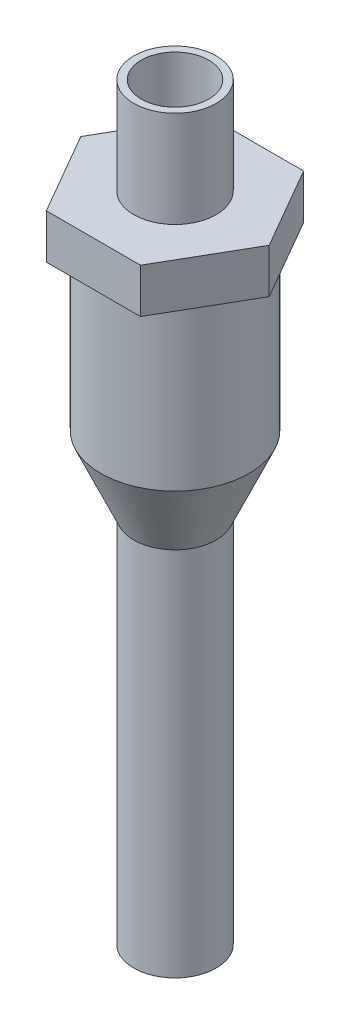
ISO-10303-21;
HEADER;
FILE_DESCRIPTION(('STEP AP214'),'2;1');
FILE_NAME('part.step','',(''),(''),'','','');
FILE_SCHEMA(('AUTOMOTIVE_DESIGN { 1 0 10303 214 1 1 1 1 }'));
ENDSEC;
DATA;
#1=APPLICATION_CONTEXT('core data for automotive mechanical design processes');
#2=APPLICATION_PROTOCOL_DEFINITION('international standard','automotive_design',2000,#1);
#3=PRODUCT_CONTEXT('',#1,'mechanical');
#4=PRODUCT('Part','Part','',(#3));
#5=PRODUCT_RELATED_PRODUCT_CATEGORY('part','',(#4));
#6=PRODUCT_DEFINITION_FORMATION('','',#4);
#7=PRODUCT_DEFINITION_CONTEXT('part definition',#1,'design');
#8=PRODUCT_DEFINITION('design','',#6,#7);
#9=PRODUCT_DEFINITION_SHAPE('','',#8);
#10=(LENGTH_UNIT() NAMED_UNIT(*) SI_UNIT(.MILLI.,.METRE.));
#11=(NAMED_UNIT(*) PLANE_ANGLE_UNIT() SI_UNIT($,.RADIAN.));
#12=(NAMED_UNIT(*) SI_UNIT($,.STERADIAN.) SOLID_ANGLE_UNIT());
#13=UNCERTAINTY_MEASURE_WITH_UNIT(LENGTH_MEASURE(1.E-05),#10,'distance_accuracy_value','');
#14=(GEOMETRIC_REPRESENTATION_CONTEXT(3) GLOBAL_UNCERTAINTY_ASSIGNED_CONTEXT((#13)) GLOBAL_UNIT_ASSIGNED_CONTEXT((#10,
#11,#12)) REPRESENTATION_CONTEXT('',''));
#15=CARTESIAN_POINT('',(0.,0.,0.));
#16=DIRECTION('',(0.,0.,1.));
#17=DIRECTION('',(1.,0.,0.));
#18=AXIS2_PLACEMENT_3D('',#15,#16,#17);
#19=CARTESIAN_POINT('',(0.,13.,0.));
#20=DIRECTION('',(0.,1.,0.));
#21=DIRECTION('',(-1.,0.,0.));
#22=AXIS2_PLACEMENT_3D('',#19,#20,#21);
#23=CYLINDRICAL_SURFACE('',#22,10.);
#24=CARTESIAN_POINT('',(0.,-28.,0.));
#25=DIRECTION('',(0.,1.,0.));
#26=DIRECTION('',(-1.,0.,0.));
#27=AXIS2_PLACEMENT_3D('',#24,#25,#26);
#28=CIRCLE('',#27,10.);
#29=CARTESIAN_POINT('',(-9.99999999999999,-28.,0.));
#30=VERTEX_POINT('',#29);
#31=EDGE_CURVE('E181',#30,#30,#28,.T.);
#32=ORIENTED_EDGE('',*,*,#31,.T.);
#33=EDGE_LOOP('',(#32));
#34=FACE_BOUND('',#33,.T.);
#35=CARTESIAN_POINT('',(0.,-6.,0.));
#36=DIRECTION('',(0.,1.,0.));
#37=DIRECTION('',(-1.,0.,0.));
#38=AXIS2_PLACEMENT_3D('',#35,#36,#37);
#39=CIRCLE('',#38,10.);
#40=CARTESIAN_POINT('',(-9.99999999999999,-6.,0.));
#41=VERTEX_POINT('',#40);
#42=EDGE_CURVE('E12',#41,#41,#39,.T.);
#43=ORIENTED_EDGE('',*,*,#42,.F.);
#44=EDGE_LOOP('',(#43));
#45=FACE_BOUND('',#44,.T.);
#46=ADVANCED_FACE('F44',(#34,#45),#23,.T.);
#47=CARTESIAN_POINT('',(0.,-38.,0.));
#48=DIRECTION('',(0.,1.,0.));
#49=DIRECTION('',(-1.,0.,0.));
#50=AXIS2_PLACEMENT_3D('',#47,#48,#49);
#51=CONICAL_SURFACE('',#50,5.55625,0.418166338393955);
#52=ORIENTED_EDGE('',*,*,#31,.F.);
#53=EDGE_LOOP('',(#52));
#54=FACE_BOUND('',#53,.T.);
#55=CARTESIAN_POINT('',(0.,-38.,0.));
#56=DIRECTION('',(0.,1.,0.));
#57=DIRECTION('',(-1.,0.,0.));
#58=AXIS2_PLACEMENT_3D('',#55,#56,#57);
#59=CIRCLE('',#58,5.55625);
#60=CARTESIAN_POINT('',(-5.55624999999999,-38.,0.));
#61=VERTEX_POINT('',#60);
#62=EDGE_CURVE('E177',#61,#61,#59,.T.);
#63=ORIENTED_EDGE('',*,*,#62,.T.);
#64=EDGE_LOOP('',(#63));
#65=FACE_BOUND('',#64,.T.);
#66=ADVANCED_FACE('F220',(#54,#65),#51,.T.);
#67=CARTESIAN_POINT('',(0.,13.,0.));
#68=DIRECTION('',(0.,1.,0.));
#69=DIRECTION('',(-1.,0.,0.));
#70=AXIS2_PLACEMENT_3D('',#67,#68,#69);
#71=CYLINDRICAL_SURFACE('',#70,5.55625);
#72=ORIENTED_EDGE('',*,*,#62,.F.);
#73=EDGE_LOOP('',(#72));
#74=FACE_BOUND('',#73,.T.);
#75=CARTESIAN_POINT('',(0.,-88.,0.));
#76=DIRECTION('',(0.,1.,0.));
#77=DIRECTION('',(-1.,0.,0.));
#78=AXIS2_PLACEMENT_3D('',#75,#76,#77);
#79=CIRCLE('',#78,5.55624999999999);
#80=CARTESIAN_POINT('',(-5.55624999999998,-88.,0.));
#81=VERTEX_POINT('',#80);
#82=EDGE_CURVE('E164',#81,#81,#79,.T.);
#83=ORIENTED_EDGE('',*,*,#82,.T.);
#84=EDGE_LOOP('',(#83));
#85=FACE_BOUND('',#84,.T.);
#86=ADVANCED_FACE('F226',(#74,#85),#71,.T.);
#87=CARTESIAN_POINT('',(5.55625000000001,-88.,0.));
#88=DIRECTION('',(0.,1.,0.));
#89=DIRECTION('',(-1.,0.,0.));
#90=AXIS2_PLACEMENT_3D('',#87,#88,#89);
#91=PLANE('',#90);
#92=ORIENTED_EDGE('',*,*,#82,.F.);
#93=EDGE_LOOP('',(#92));
#94=FACE_BOUND('',#93,.T.);
#95=ADVANCED_FACE('F216',(#94),#91,.F.);
#96=CARTESIAN_POINT('',(6.35085296108589,-6.,11.));
#97=DIRECTION('',(0.866025403784439,0.,0.5));
#98=DIRECTION('',(0.5,0.,-0.866025403784439));
#99=AXIS2_PLACEMENT_3D('',#96,#97,#98);
#100=PLANE('',#99);
#101=DIRECTION('',(0.5,0.,-0.866025403784439));
#102=VECTOR('',#101,1.);
#103=CARTESIAN_POINT('',(6.35085296108589,0.,11.));
#104=LINE('',#103,#102);
#105=CARTESIAN_POINT('',(6.35085296108589,0.,11.));
#106=VERTEX_POINT('',#105);
#107=CARTESIAN_POINT('',(12.7017059221718,0.,0.));
#108=VERTEX_POINT('',#107);
#109=EDGE_CURVE('E140',#106,#108,#104,.T.);
#110=ORIENTED_EDGE('',*,*,#109,.F.);
#111=DIRECTION('',(0.,1.,0.));
#112=VECTOR('',#111,1.);
#113=CARTESIAN_POINT('',(6.35085296108589,-6.,11.));
#114=LINE('',#113,#112);
#115=CARTESIAN_POINT('',(6.35085296108589,-6.,11.));
#116=VERTEX_POINT('',#115);
#117=EDGE_CURVE('E62',#116,#106,#114,.T.);
#118=ORIENTED_EDGE('',*,*,#117,.F.);
#119=DIRECTION('',(0.5,0.,-0.866025403784439));
#120=VECTOR('',#119,1.);
#121=CARTESIAN_POINT('',(6.35085296108589,-6.,11.));
#122=LINE('',#121,#120);
#123=CARTESIAN_POINT('',(12.7017059221718,-6.,0.));
#124=VERTEX_POINT('',#123);
#125=EDGE_CURVE('E161',#116,#124,#122,.T.);
#126=ORIENTED_EDGE('',*,*,#125,.T.);
#127=DIRECTION('',(0.,1.,0.));
#128=VECTOR('',#127,1.);
#129=CARTESIAN_POINT('',(12.7017059221718,-6.,0.));
#130=LINE('',#129,#128);
#131=EDGE_CURVE('E97',#124,#108,#130,.T.);
#132=ORIENTED_EDGE('',*,*,#131,.T.);
#133=EDGE_LOOP('',(#110,#118,#126,#132));
#134=FACE_BOUND('',#133,.T.);
#135=ADVANCED_FACE('F203',(#134),#100,.T.);
#136=CARTESIAN_POINT('',(-6.35085296108588,-6.,11.));
#137=DIRECTION('',(0.,0.,1.));
#138=DIRECTION('',(1.,0.,0.));
#139=AXIS2_PLACEMENT_3D('',#136,#137,#138);
#140=PLANE('',#139);
#141=DIRECTION('',(1.,0.,0.));
#142=VECTOR('',#141,1.);
#143=CARTESIAN_POINT('',(-6.35085296108588,0.,11.));
#144=LINE('',#143,#142);
#145=CARTESIAN_POINT('',(-6.35085296108588,0.,11.));
#146=VERTEX_POINT('',#145);
#147=EDGE_CURVE('E158',#146,#106,#144,.T.);
#148=ORIENTED_EDGE('',*,*,#147,.F.);
#149=DIRECTION('',(0.,1.,0.));
#150=VECTOR('',#149,1.);
#151=CARTESIAN_POINT('',(-6.35085296108588,-6.,11.));
#152=LINE('',#151,#150);
#153=CARTESIAN_POINT('',(-6.35085296108588,-6.,11.));
#154=VERTEX_POINT('',#153);
#155=EDGE_CURVE('E85',#154,#146,#152,.T.);
#156=ORIENTED_EDGE('',*,*,#155,.F.);
#157=DIRECTION('',(1.,0.,0.));
#158=VECTOR('',#157,1.);
#159=CARTESIAN_POINT('',(-6.35085296108588,-6.,11.));
#160=LINE('',#159,#158);
#161=EDGE_CURVE('E124',#154,#116,#160,.T.);
#162=ORIENTED_EDGE('',*,*,#161,.T.);
#163=ORIENTED_EDGE('',*,*,#117,.T.);
#164=EDGE_LOOP('',(#148,#156,#162,#163));
#165=FACE_BOUND('',#164,.T.);
#166=ADVANCED_FACE('F208',(#165),#140,.T.);
#167=CARTESIAN_POINT('',(-12.7017059221718,-6.,0.));
#168=DIRECTION('',(-0.866025403784439,0.,0.5));
#169=DIRECTION('',(0.5,0.,0.866025403784439));
#170=AXIS2_PLACEMENT_3D('',#167,#168,#169);
#171=PLANE('',#170);
#172=DIRECTION('',(0.5,0.,0.866025403784438));
#173=VECTOR('',#172,1.);
#174=CARTESIAN_POINT('',(-12.7017059221718,0.,0.));
#175=LINE('',#174,#173);
#176=CARTESIAN_POINT('',(-12.7017059221718,0.,0.));
#177=VERTEX_POINT('',#176);
#178=EDGE_CURVE('E110',#177,#146,#175,.T.);
#179=ORIENTED_EDGE('',*,*,#178,.F.);
#180=DIRECTION('',(0.,1.,0.));
#181=VECTOR('',#180,1.);
#182=CARTESIAN_POINT('',(-12.7017059221718,-6.,0.));
#183=LINE('',#182,#181);
#184=CARTESIAN_POINT('',(-12.7017059221718,-6.,0.));
#185=VERTEX_POINT('',#184);
#186=EDGE_CURVE('E105',#185,#177,#183,.T.);
#187=ORIENTED_EDGE('',*,*,#186,.F.);
#188=DIRECTION('',(0.5,0.,0.866025403784438));
#189=VECTOR('',#188,1.);
#190=CARTESIAN_POINT('',(-12.7017059221718,-6.,0.));
#191=LINE('',#190,#189);
#192=EDGE_CURVE('E108',#185,#154,#191,.T.);
#193=ORIENTED_EDGE('',*,*,#192,.T.);
#194=ORIENTED_EDGE('',*,*,#155,.T.);
#195=EDGE_LOOP('',(#179,#187,#193,#194));
#196=FACE_BOUND('',#195,.T.);
#197=ADVANCED_FACE('F107',(#196),#171,.T.);
#198=CARTESIAN_POINT('',(-6.35085296108588,-6.,-11.));
#199=DIRECTION('',(-0.866025403784439,0.,-0.5));
#200=DIRECTION('',(-0.5,0.,0.866025403784439));
#201=AXIS2_PLACEMENT_3D('',#198,#199,#200);
#202=PLANE('',#201);
#203=DIRECTION('',(-0.5,0.,0.866025403784439));
#204=VECTOR('',#203,1.);
#205=CARTESIAN_POINT('',(-6.35085296108588,0.,-11.));
#206=LINE('',#205,#204);
#207=CARTESIAN_POINT('',(-6.35085296108588,0.,-11.));
#208=VERTEX_POINT('',#207);
#209=EDGE_CURVE('E153',#208,#177,#206,.T.);
#210=ORIENTED_EDGE('',*,*,#209,.F.);
#211=DIRECTION('',(0.,1.,0.));
#212=VECTOR('',#211,1.);
#213=CARTESIAN_POINT('',(-6.35085296108588,-6.,-11.));
#214=LINE('',#213,#212);
#215=CARTESIAN_POINT('',(-6.35085296108588,-6.,-11.));
#216=VERTEX_POINT('',#215);
#217=EDGE_CURVE('E116',#216,#208,#214,.T.);
#218=ORIENTED_EDGE('',*,*,#217,.F.);
#219=DIRECTION('',(-0.5,0.,0.866025403784439));
#220=VECTOR('',#219,1.);
#221=CARTESIAN_POINT('',(-6.35085296108588,-6.,-11.));
#222=LINE('',#221,#220);
#223=EDGE_CURVE('E122',#216,#185,#222,.T.);
#224=ORIENTED_EDGE('',*,*,#223,.T.);
#225=ORIENTED_EDGE('',*,*,#186,.T.);
#226=EDGE_LOOP('',(#210,#218,#224,#225));
#227=FACE_BOUND('',#226,.T.);
#228=ADVANCED_FACE('F127',(#227),#202,.T.);
#229=CARTESIAN_POINT('',(6.35085296108589,-6.,-11.));
#230=DIRECTION('',(0.,0.,-1.));
#231=DIRECTION('',(-1.,0.,0.));
#232=AXIS2_PLACEMENT_3D('',#229,#230,#231);
#233=PLANE('',#232);
#234=DIRECTION('',(-1.,0.,0.));
#235=VECTOR('',#234,1.);
#236=CARTESIAN_POINT('',(6.35085296108589,0.,-11.));
#237=LINE('',#236,#235);
#238=CARTESIAN_POINT('',(6.35085296108589,0.,-11.));
#239=VERTEX_POINT('',#238);
#240=EDGE_CURVE('E149',#239,#208,#237,.T.);
#241=ORIENTED_EDGE('',*,*,#240,.F.);
#242=DIRECTION('',(0.,1.,0.));
#243=VECTOR('',#242,1.);
#244=CARTESIAN_POINT('',(6.35085296108589,-6.,-11.));
#245=LINE('',#244,#243);
#246=CARTESIAN_POINT('',(6.35085296108589,-6.,-11.));
#247=VERTEX_POINT('',#246);
#248=EDGE_CURVE('E169',#247,#239,#245,.T.);
#249=ORIENTED_EDGE('',*,*,#248,.F.);
#250=DIRECTION('',(-1.,0.,0.));
#251=VECTOR('',#250,1.);
#252=CARTESIAN_POINT('',(6.35085296108589,-6.,-11.));
#253=LINE('',#252,#251);
#254=EDGE_CURVE('E129',#247,#216,#253,.T.);
#255=ORIENTED_EDGE('',*,*,#254,.T.);
#256=ORIENTED_EDGE('',*,*,#217,.T.);
#257=EDGE_LOOP('',(#241,#249,#255,#256));
#258=FACE_BOUND('',#257,.T.);
#259=ADVANCED_FACE('F207',(#258),#233,.T.);
#260=CARTESIAN_POINT('',(12.7017059221718,-6.,0.));
#261=DIRECTION('',(0.866025403784439,0.,-0.5));
#262=DIRECTION('',(-0.5,0.,-0.866025403784439));
#263=AXIS2_PLACEMENT_3D('',#260,#261,#262);
#264=PLANE('',#263);
#265=DIRECTION('',(-0.5,0.,-0.866025403784439));
#266=VECTOR('',#265,1.);
#267=CARTESIAN_POINT('',(12.7017059221718,0.,0.));
#268=LINE('',#267,#266);
#269=EDGE_CURVE('E144',#108,#239,#268,.T.);
#270=ORIENTED_EDGE('',*,*,#269,.F.);
#271=ORIENTED_EDGE('',*,*,#131,.F.);
#272=DIRECTION('',(-0.5,0.,-0.866025403784439));
#273=VECTOR('',#272,1.);
#274=CARTESIAN_POINT('',(12.7017059221718,-6.,0.));
#275=LINE('',#274,#273);
#276=EDGE_CURVE('E134',#124,#247,#275,.T.);
#277=ORIENTED_EDGE('',*,*,#276,.T.);
#278=ORIENTED_EDGE('',*,*,#248,.T.);
#279=EDGE_LOOP('',(#270,#271,#277,#278));
#280=FACE_BOUND('',#279,.T.);
#281=ADVANCED_FACE('F204',(#280),#264,.T.);
#282=CARTESIAN_POINT('',(0.,-6.,0.));
#283=DIRECTION('',(0.,1.,0.));
#284=DIRECTION('',(-1.,0.,0.));
#285=AXIS2_PLACEMENT_3D('',#282,#283,#284);
#286=PLANE('',#285);
#287=ORIENTED_EDGE('',*,*,#42,.T.);
#288=EDGE_LOOP('',(#287));
#289=FACE_BOUND('',#288,.T.);
#290=ORIENTED_EDGE('',*,*,#125,.F.);
#291=ORIENTED_EDGE('',*,*,#161,.F.);
#292=ORIENTED_EDGE('',*,*,#192,.F.);
#293=ORIENTED_EDGE('',*,*,#223,.F.);
#294=ORIENTED_EDGE('',*,*,#254,.F.);
#295=ORIENTED_EDGE('',*,*,#276,.F.);
#296=EDGE_LOOP('',(#290,#291,#292,#293,#294,#295));
#297=FACE_BOUND('',#296,.T.);
#298=ADVANCED_FACE('F120',(#289,#297),#286,.F.);
#299=CARTESIAN_POINT('',(0.,13.,0.));
#300=DIRECTION('',(0.,-1.,0.));
#301=DIRECTION('',(1.,0.,0.));
#302=AXIS2_PLACEMENT_3D('',#299,#300,#301);
#303=PLANE('',#302);
#304=CARTESIAN_POINT('',(0.,13.,0.));
#305=DIRECTION('',(0.,1.,0.));
#306=DIRECTION('',(-1.,0.,0.));
#307=AXIS2_PLACEMENT_3D('',#304,#305,#306);
#308=CIRCLE('',#307,4.55625);
#309=CARTESIAN_POINT('',(-4.55624999999999,13.,0.));
#310=VERTEX_POINT('',#309);
#311=EDGE_CURVE('E378',#310,#310,#308,.T.);
#312=ORIENTED_EDGE('',*,*,#311,.F.);
#313=EDGE_LOOP('',(#312));
#314=FACE_BOUND('',#313,.T.);
#315=CARTESIAN_POINT('',(0.,13.,0.));
#316=DIRECTION('',(0.,1.,0.));
#317=DIRECTION('',(-1.,0.,0.));
#318=AXIS2_PLACEMENT_3D('',#315,#316,#317);
#319=CIRCLE('',#318,5.55625);
#320=CARTESIAN_POINT('',(-5.55625,13.,0.));
#321=VERTEX_POINT('',#320);
#322=EDGE_CURVE('E54',#321,#321,#319,.T.);
#323=ORIENTED_EDGE('',*,*,#322,.T.);
#324=EDGE_LOOP('',(#323));
#325=FACE_BOUND('',#324,.T.);
#326=ADVANCED_FACE('F46',(#314,#325),#303,.F.);
#327=CARTESIAN_POINT('',(0.,13.,0.));
#328=DIRECTION('',(0.,1.,0.));
#329=DIRECTION('',(-1.,0.,0.));
#330=AXIS2_PLACEMENT_3D('',#327,#328,#329);
#331=CYLINDRICAL_SURFACE('',#330,5.55625);
#332=ORIENTED_EDGE('',*,*,#322,.F.);
#333=EDGE_LOOP('',(#332));
#334=FACE_BOUND('',#333,.T.);
#335=CARTESIAN_POINT('',(0.,0.,0.));
#336=DIRECTION('',(0.,1.,0.));
#337=DIRECTION('',(-1.,0.,0.));
#338=AXIS2_PLACEMENT_3D('',#335,#336,#337);
#339=CIRCLE('',#338,5.55625);
#340=CARTESIAN_POINT('',(-5.55624999999999,0.,0.));
#341=VERTEX_POINT('',#340);
#342=EDGE_CURVE('E185',#341,#341,#339,.T.);
#343=ORIENTED_EDGE('',*,*,#342,.T.);
#344=EDGE_LOOP('',(#343));
#345=FACE_BOUND('',#344,.T.);
#346=ADVANCED_FACE('F193',(#334,#345),#331,.T.);
#347=CARTESIAN_POINT('',(5.55625,0.,0.));
#348=DIRECTION('',(0.,-1.,0.));
#349=DIRECTION('',(1.,0.,0.));
#350=AXIS2_PLACEMENT_3D('',#347,#348,#349);
#351=PLANE('',#350);
#352=ORIENTED_EDGE('',*,*,#342,.F.);
#353=EDGE_LOOP('',(#352));
#354=FACE_BOUND('',#353,.T.);
#355=ORIENTED_EDGE('',*,*,#109,.T.);
#356=ORIENTED_EDGE('',*,*,#269,.T.);
#357=ORIENTED_EDGE('',*,*,#240,.T.);
#358=ORIENTED_EDGE('',*,*,#209,.T.);
#359=ORIENTED_EDGE('',*,*,#178,.T.);
#360=ORIENTED_EDGE('',*,*,#147,.T.);
#361=EDGE_LOOP('',(#355,#356,#357,#358,#359,#360));
#362=FACE_BOUND('',#361,.T.);
#363=ADVANCED_FACE('F196',(#354,#362),#351,.F.);
#364=CARTESIAN_POINT('',(0.,-100.887021087125,0.));
#365=DIRECTION('',(0.,1.,0.));
#366=DIRECTION('',(-1.,0.,0.));
#367=AXIS2_PLACEMENT_3D('',#364,#365,#366);
#368=CYLINDRICAL_SURFACE('',#367,4.55625);
#369=CARTESIAN_POINT('',(0.,-86.,0.));
#370=DIRECTION('',(0.,1.,0.));
#371=DIRECTION('',(-1.,0.,0.));
#372=AXIS2_PLACEMENT_3D('',#369,#370,#371);
#373=CIRCLE('',#372,4.55625);
#374=CARTESIAN_POINT('',(-4.55624999999998,-86.,0.));
#375=VERTEX_POINT('',#374);
#376=EDGE_CURVE('E145',#375,#375,#373,.F.);
#377=CARTESIAN_POINT('',(-4.55624999999998,-86.,0.));
#378=CARTESIAN_POINT('',(-4.55624999999998,-84.96875,0.));
#379=CARTESIAN_POINT('',(-4.55624999999998,-83.9375,0.));
#380=CARTESIAN_POINT('',(-4.55624999999998,-81.875,0.));
#381=CARTESIAN_POINT('',(-4.55624999999998,-80.84375,0.));
#382=CARTESIAN_POINT('',(-4.55624999999998,-78.78125,0.));
#383=CARTESIAN_POINT('',(-4.55624999999998,-77.75,0.));
#384=CARTESIAN_POINT('',(-4.55624999999998,-75.6875,0.));
#385=CARTESIAN_POINT('',(-4.55624999999998,-74.65625,0.));
#386=CARTESIAN_POINT('',(-4.55624999999998,-72.59375,0.));
#387=CARTESIAN_POINT('',(-4.55624999999998,-71.5625,0.));
#388=CARTESIAN_POINT('',(-4.55624999999998,-69.5,0.));
#389=CARTESIAN_POINT('',(-4.55624999999998,-68.46875,0.));
#390=CARTESIAN_POINT('',(-4.55624999999998,-66.40625,0.));
#391=CARTESIAN_POINT('',(-4.55624999999998,-65.375,0.));
#392=CARTESIAN_POINT('',(-4.55624999999998,-63.3125,0.));
#393=CARTESIAN_POINT('',(-4.55624999999998,-62.28125,0.));
#394=CARTESIAN_POINT('',(-4.55624999999998,-60.21875,0.));
#395=CARTESIAN_POINT('',(-4.55624999999998,-59.1875,0.));
#396=CARTESIAN_POINT('',(-4.55624999999998,-57.125,0.));
#397=CARTESIAN_POINT('',(-4.55624999999999,-56.09375,0.));
#398=CARTESIAN_POINT('',(-4.55624999999999,-54.03125,0.));
#399=CARTESIAN_POINT('',(-4.55624999999999,-53.,0.));
#400=CARTESIAN_POINT('',(-4.55624999999999,-50.9375,0.));
#401=CARTESIAN_POINT('',(-4.55624999999999,-49.90625,0.));
#402=CARTESIAN_POINT('',(-4.55624999999999,-47.84375,0.));
#403=CARTESIAN_POINT('',(-4.55624999999999,-46.8125,0.));
#404=CARTESIAN_POINT('',(-4.55624999999999,-44.75,0.));
#405=CARTESIAN_POINT('',(-4.55624999999999,-43.71875,0.));
#406=CARTESIAN_POINT('',(-4.55624999999999,-41.65625,0.));
#407=CARTESIAN_POINT('',(-4.55624999999999,-40.625,0.));
#408=CARTESIAN_POINT('',(-4.55624999999999,-38.5625,0.));
#409=CARTESIAN_POINT('',(-4.55624999999999,-37.53125,0.));
#410=CARTESIAN_POINT('',(-4.55624999999999,-35.46875,0.));
#411=CARTESIAN_POINT('',(-4.55624999999999,-34.4375,0.));
#412=CARTESIAN_POINT('',(-4.55624999999999,-32.375,0.));
#413=CARTESIAN_POINT('',(-4.55624999999999,-31.34375,0.));
#414=CARTESIAN_POINT('',(-4.55624999999999,-29.28125,0.));
#415=CARTESIAN_POINT('',(-4.55624999999999,-28.25,0.));
#416=CARTESIAN_POINT('',(-4.55624999999999,-26.1875,0.));
#417=CARTESIAN_POINT('',(-4.55624999999999,-25.15625,0.));
#418=CARTESIAN_POINT('',(-4.55624999999999,-23.09375,0.));
#419=CARTESIAN_POINT('',(-4.55624999999999,-22.0625,0.));
#420=CARTESIAN_POINT('',(-4.55624999999999,-20.,0.));
#421=CARTESIAN_POINT('',(-4.55624999999999,-18.96875,0.));
#422=CARTESIAN_POINT('',(-4.55624999999999,-16.90625,0.));
#423=CARTESIAN_POINT('',(-4.55624999999999,-15.875,0.));
#424=CARTESIAN_POINT('',(-4.55624999999999,-13.8125,0.));
#425=CARTESIAN_POINT('',(-4.55624999999999,-12.78125,0.));
#426=CARTESIAN_POINT('',(-4.55624999999999,-10.71875,0.));
#427=CARTESIAN_POINT('',(-4.55624999999999,-9.68750000000001,0.));
#428=CARTESIAN_POINT('',(-4.55624999999999,-7.62500000000002,0.));
#429=CARTESIAN_POINT('',(-4.55624999999999,-6.59375000000001,0.));
#430=CARTESIAN_POINT('',(-4.55624999999999,-4.53125000000001,0.));
#431=CARTESIAN_POINT('',(-4.55624999999999,-3.50000000000001,0.));
#432=CARTESIAN_POINT('',(-4.55624999999999,-1.4375,0.));
#433=CARTESIAN_POINT('',(-4.55624999999999,-0.406250000000001,0.));
#434=CARTESIAN_POINT('',(-4.55624999999999,1.65624999999999,0.));
#435=CARTESIAN_POINT('',(-4.55624999999999,2.68749999999999,0.));
#436=CARTESIAN_POINT('',(-4.55624999999999,4.74999999999998,0.));
#437=CARTESIAN_POINT('',(-4.55624999999999,5.78124999999998,0.));
#438=CARTESIAN_POINT('',(-4.55624999999999,7.84374999999999,0.));
#439=CARTESIAN_POINT('',(-4.55624999999999,8.87499999999999,0.));
#440=CARTESIAN_POINT('',(-4.55624999999999,10.9375,0.));
#441=CARTESIAN_POINT('',(-4.55624999999999,11.96875,0.));
#442=CARTESIAN_POINT('',(-4.55624999999999,13.,0.));
#443=B_SPLINE_CURVE_WITH_KNOTS('',3,(#377,#378,#379,#380,#381,#382,#383,#384,#385,#386,#387,
#388,#389,#390,#391,#392,#393,#394,#395,#396,#397,#398,#399,#400,#401,#402,#403,#404,#405,#406,
#407,#408,#409,#410,#411,#412,#413,#414,#415,#416,#417,#418,#419,#420,#421,#422,#423,#424,#425,
#426,#427,#428,#429,#430,#431,#432,#433,#434,#435,#436,#437,#438,#439,#440,#441,#442),
.UNSPECIFIED.,.F.,.F.,(4,2,2,2,2,2,2,2,2,2,2,2,2,2,2,2,2,2,2,2,2,2,2,2,2,2,2,2,2,2,2,2,4),(0.,
3.09375000000001,6.1875,9.28125000000001,12.375,15.46875,18.5625,21.65625,24.75,27.84375,
30.9375,34.03125,37.125,40.21875,43.3125,46.40625,49.5,52.59375,55.6875,58.78125,61.875,
64.96875,68.0625,71.15625,74.25,77.34375,80.4375,83.53125,86.625,89.71875,92.8125,95.90625,99.),.UNSPECIFIED.);
#444=EDGE_CURVE('BSEAM201',#375,#310,#443,.T.);
#445=ORIENTED_EDGE('',*,*,#376,.T.);
#446=ORIENTED_EDGE('',*,*,#311,.T.);
#447=ORIENTED_EDGE('',*,*,#444,.T.);
#448=ORIENTED_EDGE('',*,*,#444,.F.);
#449=EDGE_LOOP('',(#445,#447,#446,#448));
#450=FACE_BOUND('',#449,.T.);
#451=ADVANCED_FACE('F201',(#450),#368,.F.);
#452=CARTESIAN_POINT('',(5.55625000000001,-86.,0.));
#453=DIRECTION('',(0.,1.,0.));
#454=DIRECTION('',(-1.,0.,0.));
#455=AXIS2_PLACEMENT_3D('',#452,#453,#454);
#456=PLANE('',#455);
#457=ORIENTED_EDGE('',*,*,#376,.F.);
#458=EDGE_LOOP('',(#457));
#459=FACE_BOUND('',#458,.T.);
#460=ADVANCED_FACE('F273',(#459),#456,.T.);
#461=CLOSED_SHELL('',(#46,#66,#86,#95,#135,#166,#197,#228,#259,#281,#298,#326,#346,#363,#451,#460));
#462=MANIFOLD_SOLID_BREP('B2',#461);
#463=ADVANCED_BREP_SHAPE_REPRESENTATION('',(#18,#462),#14);
#464=SHAPE_DEFINITION_REPRESENTATION(#9,#463);
ENDSEC;
END-ISO-10303-21;
